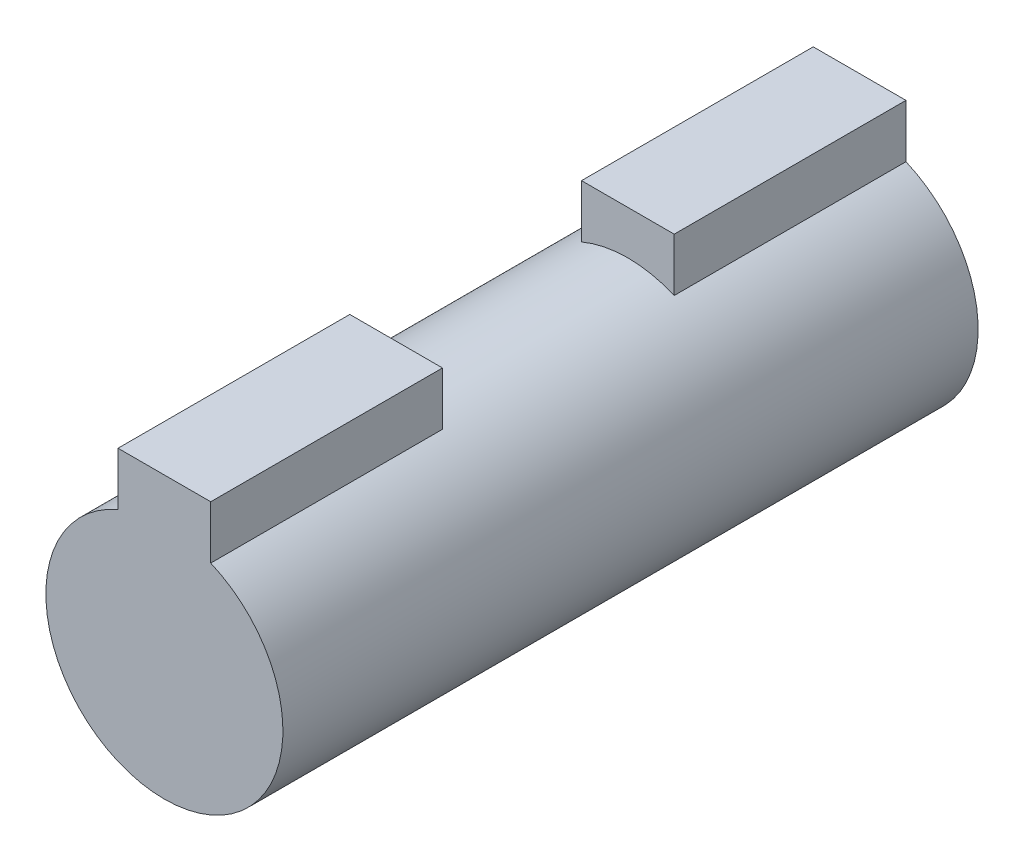
ISO-10303-21;
HEADER;
FILE_DESCRIPTION(('STEP AP214'),'2;1');
FILE_NAME('part.step','',(''),(''),'','','');
FILE_SCHEMA(('AUTOMOTIVE_DESIGN { 1 0 10303 214 1 1 1 1 }'));
ENDSEC;
DATA;
#1=APPLICATION_CONTEXT('core data for automotive mechanical design processes');
#2=APPLICATION_PROTOCOL_DEFINITION('international standard','automotive_design',2000,#1);
#3=PRODUCT_CONTEXT('',#1,'mechanical');
#4=PRODUCT('Part','Part','',(#3));
#5=PRODUCT_RELATED_PRODUCT_CATEGORY('part','',(#4));
#6=PRODUCT_DEFINITION_FORMATION('','',#4);
#7=PRODUCT_DEFINITION_CONTEXT('part definition',#1,'design');
#8=PRODUCT_DEFINITION('design','',#6,#7);
#9=PRODUCT_DEFINITION_SHAPE('','',#8);
#10=(LENGTH_UNIT() NAMED_UNIT(*) SI_UNIT(.MILLI.,.METRE.));
#11=(NAMED_UNIT(*) PLANE_ANGLE_UNIT() SI_UNIT($,.RADIAN.));
#12=(NAMED_UNIT(*) SI_UNIT($,.STERADIAN.) SOLID_ANGLE_UNIT());
#13=UNCERTAINTY_MEASURE_WITH_UNIT(LENGTH_MEASURE(1.E-05),#10,'distance_accuracy_value','');
#14=(GEOMETRIC_REPRESENTATION_CONTEXT(3) GLOBAL_UNCERTAINTY_ASSIGNED_CONTEXT((#13)) GLOBAL_UNIT_ASSIGNED_CONTEXT((#10,
#11,#12)) REPRESENTATION_CONTEXT('',''));
#15=CARTESIAN_POINT('',(0.,0.,0.));
#16=DIRECTION('',(0.,0.,1.));
#17=DIRECTION('',(1.,0.,0.));
#18=AXIS2_PLACEMENT_3D('',#15,#16,#17);
#19=CARTESIAN_POINT('',(2.,7.,30.));
#20=DIRECTION('',(-1.,0.,0.));
#21=DIRECTION('',(0.,0.,1.));
#22=AXIS2_PLACEMENT_3D('',#19,#20,#21);
#23=PLANE('',#22);
#24=DIRECTION('',(0.,1.,0.));
#25=VECTOR('',#24,1.);
#26=CARTESIAN_POINT('',(2.,7.,10.));
#27=LINE('',#26,#25);
#28=CARTESIAN_POINT('',(2.,4.70724019463634,10.));
#29=VERTEX_POINT('',#28);
#30=CARTESIAN_POINT('',(2.,7.,10.));
#31=VERTEX_POINT('',#30);
#32=EDGE_CURVE('E113',#29,#31,#27,.T.);
#33=ORIENTED_EDGE('',*,*,#32,.F.);
#34=DIRECTION('',(0.,0.,-1.));
#35=VECTOR('',#34,1.);
#36=CARTESIAN_POINT('',(2.,4.70724019463634,30.));
#37=LINE('',#36,#35);
#38=CARTESIAN_POINT('',(2.,4.70724019463634,0.));
#39=VERTEX_POINT('',#38);
#40=EDGE_CURVE('E123',#29,#39,#37,.T.);
#41=ORIENTED_EDGE('',*,*,#40,.T.);
#42=DIRECTION('',(0.,1.,0.));
#43=VECTOR('',#42,1.);
#44=CARTESIAN_POINT('',(2.,7.,0.));
#45=LINE('',#44,#43);
#46=CARTESIAN_POINT('',(2.,7.,0.));
#47=VERTEX_POINT('',#46);
#48=EDGE_CURVE('E173',#39,#47,#45,.T.);
#49=ORIENTED_EDGE('',*,*,#48,.T.);
#50=DIRECTION('',(0.,0.,-1.));
#51=VECTOR('',#50,1.);
#52=CARTESIAN_POINT('',(2.,7.,30.));
#53=LINE('',#52,#51);
#54=EDGE_CURVE('E125',#31,#47,#53,.T.);
#55=ORIENTED_EDGE('',*,*,#54,.F.);
#56=EDGE_LOOP('',(#33,#41,#49,#55));
#57=FACE_BOUND('',#56,.T.);
#58=ADVANCED_FACE('F39',(#57),#23,.F.);
#59=CARTESIAN_POINT('',(-2.,7.,30.));
#60=DIRECTION('',(0.,-1.,0.));
#61=DIRECTION('',(0.,0.,-1.));
#62=AXIS2_PLACEMENT_3D('',#59,#60,#61);
#63=PLANE('',#62);
#64=DIRECTION('',(-1.,0.,0.));
#65=VECTOR('',#64,1.);
#66=CARTESIAN_POINT('',(-2.,7.,10.));
#67=LINE('',#66,#65);
#68=CARTESIAN_POINT('',(-2.,7.,10.));
#69=VERTEX_POINT('',#68);
#70=EDGE_CURVE('E128',#31,#69,#67,.T.);
#71=ORIENTED_EDGE('',*,*,#70,.F.);
#72=ORIENTED_EDGE('',*,*,#54,.T.);
#73=DIRECTION('',(-1.,0.,0.));
#74=VECTOR('',#73,1.);
#75=CARTESIAN_POINT('',(-2.,7.,0.));
#76=LINE('',#75,#74);
#77=CARTESIAN_POINT('',(-2.,7.,0.));
#78=VERTEX_POINT('',#77);
#79=EDGE_CURVE('E171',#47,#78,#76,.T.);
#80=ORIENTED_EDGE('',*,*,#79,.T.);
#81=DIRECTION('',(0.,0.,-1.));
#82=VECTOR('',#81,1.);
#83=CARTESIAN_POINT('',(-2.,7.,30.));
#84=LINE('',#83,#82);
#85=EDGE_CURVE('E157',#69,#78,#84,.T.);
#86=ORIENTED_EDGE('',*,*,#85,.F.);
#87=EDGE_LOOP('',(#71,#72,#80,#86));
#88=FACE_BOUND('',#87,.T.);
#89=ADVANCED_FACE('F168',(#88),#63,.F.);
#90=CARTESIAN_POINT('',(-2.,7.,30.));
#91=DIRECTION('',(1.,0.,0.));
#92=DIRECTION('',(0.,1.,0.));
#93=AXIS2_PLACEMENT_3D('',#90,#91,#92);
#94=PLANE('',#93);
#95=DIRECTION('',(0.,-1.,0.));
#96=VECTOR('',#95,1.);
#97=CARTESIAN_POINT('',(-2.,7.,10.));
#98=LINE('',#97,#96);
#99=CARTESIAN_POINT('',(-2.,4.70724019463634,10.));
#100=VERTEX_POINT('',#99);
#101=EDGE_CURVE('E11',#69,#100,#98,.T.);
#102=ORIENTED_EDGE('',*,*,#101,.F.);
#103=ORIENTED_EDGE('',*,*,#85,.T.);
#104=DIRECTION('',(0.,-1.,0.));
#105=VECTOR('',#104,1.);
#106=CARTESIAN_POINT('',(-2.,7.,0.));
#107=LINE('',#106,#105);
#108=CARTESIAN_POINT('',(-2.,4.70724019463634,0.));
#109=VERTEX_POINT('',#108);
#110=EDGE_CURVE('E162',#78,#109,#107,.T.);
#111=ORIENTED_EDGE('',*,*,#110,.T.);
#112=DIRECTION('',(0.,0.,-1.));
#113=VECTOR('',#112,1.);
#114=CARTESIAN_POINT('',(-2.,4.70724019463634,30.));
#115=LINE('',#114,#113);
#116=EDGE_CURVE('E82',#100,#109,#115,.T.);
#117=ORIENTED_EDGE('',*,*,#116,.F.);
#118=EDGE_LOOP('',(#102,#103,#111,#117));
#119=FACE_BOUND('',#118,.T.);
#120=ADVANCED_FACE('F215',(#119),#94,.F.);
#121=CARTESIAN_POINT('',(0.,0.,30.));
#122=DIRECTION('',(0.,0.,-1.));
#123=DIRECTION('',(-1.,0.,0.));
#124=AXIS2_PLACEMENT_3D('',#121,#122,#123);
#125=CYLINDRICAL_SURFACE('',#124,5.1145);
#126=CARTESIAN_POINT('',(-2.,4.70724019463634,30.));
#127=VERTEX_POINT('',#126);
#128=CARTESIAN_POINT('',(-2.,4.70724019463634,20.));
#129=VERTEX_POINT('',#128);
#130=EDGE_CURVE('E146',#127,#129,#115,.T.);
#131=ORIENTED_EDGE('',*,*,#130,.T.);
#132=CARTESIAN_POINT('',(0.,0.,20.));
#133=DIRECTION('',(0.,0.,1.));
#134=DIRECTION('',(1.,0.,0.));
#135=AXIS2_PLACEMENT_3D('',#132,#133,#134);
#136=CIRCLE('',#135,5.1145);
#137=CARTESIAN_POINT('',(2.,4.70724019463634,20.));
#138=VERTEX_POINT('',#137);
#139=EDGE_CURVE('E118',#138,#129,#136,.T.);
#140=ORIENTED_EDGE('',*,*,#139,.F.);
#141=CARTESIAN_POINT('',(2.,4.70724019463634,30.));
#142=VERTEX_POINT('',#141);
#143=EDGE_CURVE('E132',#142,#138,#37,.T.);
#144=ORIENTED_EDGE('',*,*,#143,.F.);
#145=CARTESIAN_POINT('',(0.,0.,30.));
#146=DIRECTION('',(0.,0.,1.));
#147=DIRECTION('',(1.,0.,0.));
#148=AXIS2_PLACEMENT_3D('',#145,#146,#147);
#149=CIRCLE('',#148,5.1145);
#150=EDGE_CURVE('E155',#127,#142,#149,.T.);
#151=ORIENTED_EDGE('',*,*,#150,.F.);
#152=EDGE_LOOP('',(#131,#140,#144,#151));
#153=FACE_BOUND('',#152,.T.);
#154=CARTESIAN_POINT('',(0.,0.,10.));
#155=DIRECTION('',(0.,0.,1.));
#156=DIRECTION('',(1.,0.,0.));
#157=AXIS2_PLACEMENT_3D('',#154,#155,#156);
#158=CIRCLE('',#157,5.1145);
#159=EDGE_CURVE('E55',#29,#100,#158,.T.);
#160=ORIENTED_EDGE('',*,*,#159,.T.);
#161=ORIENTED_EDGE('',*,*,#116,.T.);
#162=CARTESIAN_POINT('',(0.,0.,0.));
#163=DIRECTION('',(0.,0.,1.));
#164=DIRECTION('',(1.,0.,0.));
#165=AXIS2_PLACEMENT_3D('',#162,#163,#164);
#166=CIRCLE('',#165,5.1145);
#167=EDGE_CURVE('E127',#109,#39,#166,.T.);
#168=ORIENTED_EDGE('',*,*,#167,.T.);
#169=ORIENTED_EDGE('',*,*,#40,.F.);
#170=EDGE_LOOP('',(#160,#161,#168,#169));
#171=FACE_BOUND('',#170,.T.);
#172=ADVANCED_FACE('F41',(#153,#171),#125,.T.);
#173=ORIENTED_EDGE('',*,*,#143,.T.);
#174=DIRECTION('',(0.,1.,0.));
#175=VECTOR('',#174,1.);
#176=CARTESIAN_POINT('',(2.,7.,20.));
#177=LINE('',#176,#175);
#178=CARTESIAN_POINT('',(2.,7.,20.));
#179=VERTEX_POINT('',#178);
#180=EDGE_CURVE('E194',#138,#179,#177,.T.);
#181=ORIENTED_EDGE('',*,*,#180,.T.);
#182=CARTESIAN_POINT('',(2.,7.,30.));
#183=VERTEX_POINT('',#182);
#184=EDGE_CURVE('E133',#183,#179,#53,.T.);
#185=ORIENTED_EDGE('',*,*,#184,.F.);
#186=DIRECTION('',(0.,1.,0.));
#187=VECTOR('',#186,1.);
#188=CARTESIAN_POINT('',(2.,7.,30.));
#189=LINE('',#188,#187);
#190=EDGE_CURVE('E90',#142,#183,#189,.T.);
#191=ORIENTED_EDGE('',*,*,#190,.F.);
#192=EDGE_LOOP('',(#173,#181,#185,#191));
#193=FACE_BOUND('',#192,.T.);
#194=ADVANCED_FACE('F202',(#193),#23,.F.);
#195=ORIENTED_EDGE('',*,*,#184,.T.);
#196=DIRECTION('',(-1.,0.,0.));
#197=VECTOR('',#196,1.);
#198=CARTESIAN_POINT('',(-2.,7.,20.));
#199=LINE('',#198,#197);
#200=CARTESIAN_POINT('',(-2.,7.,20.));
#201=VERTEX_POINT('',#200);
#202=EDGE_CURVE('E117',#179,#201,#199,.T.);
#203=ORIENTED_EDGE('',*,*,#202,.T.);
#204=CARTESIAN_POINT('',(-2.,7.,30.));
#205=VERTEX_POINT('',#204);
#206=EDGE_CURVE('E149',#205,#201,#84,.T.);
#207=ORIENTED_EDGE('',*,*,#206,.F.);
#208=DIRECTION('',(-1.,0.,0.));
#209=VECTOR('',#208,1.);
#210=CARTESIAN_POINT('',(-2.,7.,30.));
#211=LINE('',#210,#209);
#212=EDGE_CURVE('E185',#183,#205,#211,.T.);
#213=ORIENTED_EDGE('',*,*,#212,.F.);
#214=EDGE_LOOP('',(#195,#203,#207,#213));
#215=FACE_BOUND('',#214,.T.);
#216=ADVANCED_FACE('F205',(#215),#63,.F.);
#217=ORIENTED_EDGE('',*,*,#206,.T.);
#218=DIRECTION('',(0.,-1.,0.));
#219=VECTOR('',#218,1.);
#220=CARTESIAN_POINT('',(-2.,7.,20.));
#221=LINE('',#220,#219);
#222=EDGE_CURVE('E48',#201,#129,#221,.T.);
#223=ORIENTED_EDGE('',*,*,#222,.T.);
#224=ORIENTED_EDGE('',*,*,#130,.F.);
#225=DIRECTION('',(0.,-1.,0.));
#226=VECTOR('',#225,1.);
#227=CARTESIAN_POINT('',(-2.,7.,30.));
#228=LINE('',#227,#226);
#229=EDGE_CURVE('E63',#205,#127,#228,.T.);
#230=ORIENTED_EDGE('',*,*,#229,.F.);
#231=EDGE_LOOP('',(#217,#223,#224,#230));
#232=FACE_BOUND('',#231,.T.);
#233=ADVANCED_FACE('F145',(#232),#94,.F.);
#234=CARTESIAN_POINT('',(0.,0.,30.));
#235=DIRECTION('',(0.,0.,1.));
#236=DIRECTION('',(1.,0.,0.));
#237=AXIS2_PLACEMENT_3D('',#234,#235,#236);
#238=PLANE('',#237);
#239=ORIENTED_EDGE('',*,*,#150,.T.);
#240=ORIENTED_EDGE('',*,*,#190,.T.);
#241=ORIENTED_EDGE('',*,*,#212,.T.);
#242=ORIENTED_EDGE('',*,*,#229,.T.);
#243=EDGE_LOOP('',(#239,#240,#241,#242));
#244=FACE_BOUND('',#243,.T.);
#245=ADVANCED_FACE('F206',(#244),#238,.T.);
#246=CARTESIAN_POINT('',(0.,0.,0.));
#247=DIRECTION('',(0.,0.,1.));
#248=DIRECTION('',(1.,0.,0.));
#249=AXIS2_PLACEMENT_3D('',#246,#247,#248);
#250=PLANE('',#249);
#251=ORIENTED_EDGE('',*,*,#167,.F.);
#252=ORIENTED_EDGE('',*,*,#110,.F.);
#253=ORIENTED_EDGE('',*,*,#79,.F.);
#254=ORIENTED_EDGE('',*,*,#48,.F.);
#255=EDGE_LOOP('',(#251,#252,#253,#254));
#256=FACE_BOUND('',#255,.T.);
#257=ADVANCED_FACE('F177',(#256),#250,.F.);
#258=CARTESIAN_POINT('',(0.,0.,10.));
#259=DIRECTION('',(0.,0.,1.));
#260=DIRECTION('',(1.,0.,0.));
#261=AXIS2_PLACEMENT_3D('',#258,#259,#260);
#262=PLANE('',#261);
#263=ORIENTED_EDGE('',*,*,#32,.T.);
#264=ORIENTED_EDGE('',*,*,#70,.T.);
#265=ORIENTED_EDGE('',*,*,#101,.T.);
#266=ORIENTED_EDGE('',*,*,#159,.F.);
#267=EDGE_LOOP('',(#263,#264,#265,#266));
#268=FACE_BOUND('',#267,.T.);
#269=ADVANCED_FACE('F112',(#268),#262,.T.);
#270=CARTESIAN_POINT('',(0.,0.,20.));
#271=DIRECTION('',(0.,0.,1.));
#272=DIRECTION('',(1.,0.,0.));
#273=AXIS2_PLACEMENT_3D('',#270,#271,#272);
#274=PLANE('',#273);
#275=ORIENTED_EDGE('',*,*,#139,.T.);
#276=ORIENTED_EDGE('',*,*,#222,.F.);
#277=ORIENTED_EDGE('',*,*,#202,.F.);
#278=ORIENTED_EDGE('',*,*,#180,.F.);
#279=EDGE_LOOP('',(#275,#276,#277,#278));
#280=FACE_BOUND('',#279,.T.);
#281=ADVANCED_FACE('F201',(#280),#274,.F.);
#282=CLOSED_SHELL('',(#58,#89,#120,#172,#194,#216,#233,#245,#257,#269,#281));
#283=MANIFOLD_SOLID_BREP('B2',#282);
#284=ADVANCED_BREP_SHAPE_REPRESENTATION('',(#18,#283),#14);
#285=SHAPE_DEFINITION_REPRESENTATION(#9,#284);
ENDSEC;
END-ISO-10303-21;
